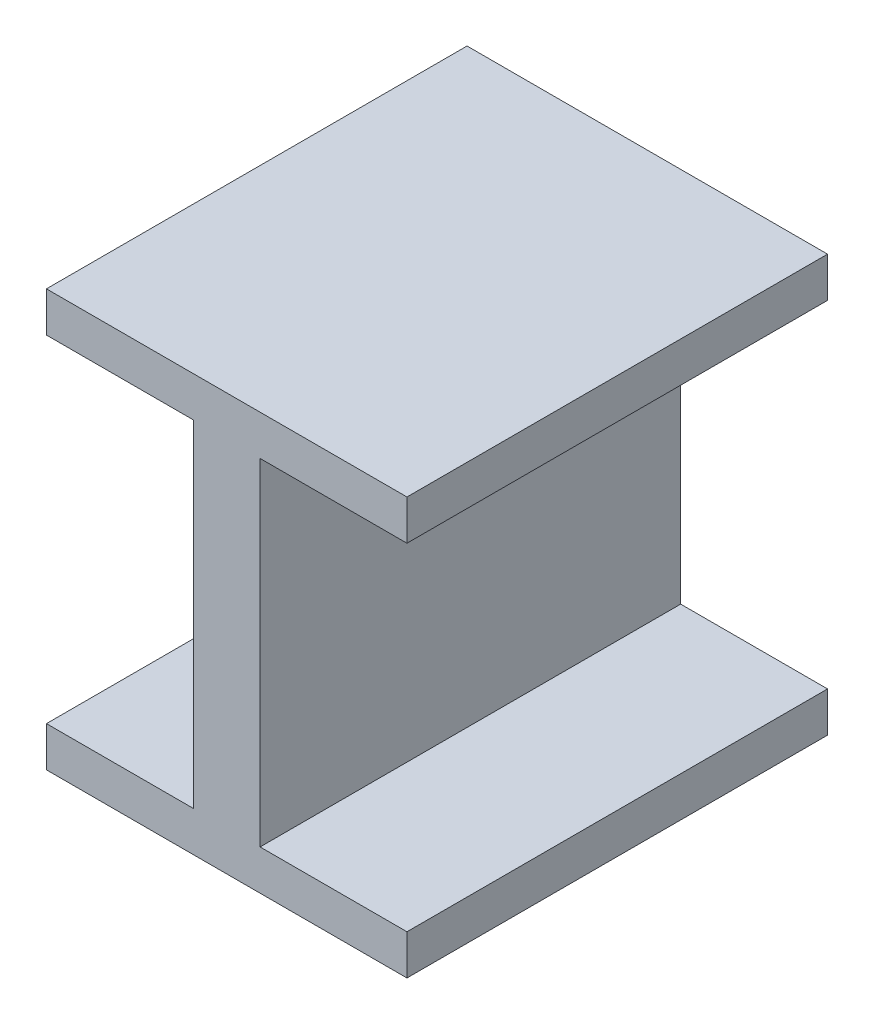
ISO-10303-21;
HEADER;
FILE_DESCRIPTION(('STEP AP214'),'2;1');
FILE_NAME('part.step','',(''),(''),'','','');
FILE_SCHEMA(('AUTOMOTIVE_DESIGN { 1 0 10303 214 1 1 1 1 }'));
ENDSEC;
DATA;
#1=APPLICATION_CONTEXT('core data for automotive mechanical design processes');
#2=APPLICATION_PROTOCOL_DEFINITION('international standard','automotive_design',2000,#1);
#3=PRODUCT_CONTEXT('',#1,'mechanical');
#4=PRODUCT('Part','Part','',(#3));
#5=PRODUCT_RELATED_PRODUCT_CATEGORY('part','',(#4));
#6=PRODUCT_DEFINITION_FORMATION('','',#4);
#7=PRODUCT_DEFINITION_CONTEXT('part definition',#1,'design');
#8=PRODUCT_DEFINITION('design','',#6,#7);
#9=PRODUCT_DEFINITION_SHAPE('','',#8);
#10=(LENGTH_UNIT() NAMED_UNIT(*) SI_UNIT(.MILLI.,.METRE.));
#11=(NAMED_UNIT(*) PLANE_ANGLE_UNIT() SI_UNIT($,.RADIAN.));
#12=(NAMED_UNIT(*) SI_UNIT($,.STERADIAN.) SOLID_ANGLE_UNIT());
#13=UNCERTAINTY_MEASURE_WITH_UNIT(LENGTH_MEASURE(1.E-05),#10,'distance_accuracy_value','');
#14=(GEOMETRIC_REPRESENTATION_CONTEXT(3) GLOBAL_UNCERTAINTY_ASSIGNED_CONTEXT((#13)) GLOBAL_UNIT_ASSIGNED_CONTEXT((#10,
#11,#12)) REPRESENTATION_CONTEXT('',''));
#15=CARTESIAN_POINT('',(0.,0.,0.));
#16=DIRECTION('',(0.,0.,1.));
#17=DIRECTION('',(1.,0.,0.));
#18=AXIS2_PLACEMENT_3D('',#15,#16,#17);
#19=CARTESIAN_POINT('',(0.,6.,0.));
#20=DIRECTION('',(0.,-1.,0.));
#21=DIRECTION('',(0.,0.,-1.));
#22=AXIS2_PLACEMENT_3D('',#19,#20,#21);
#23=PLANE('',#22);
#24=DIRECTION('',(0.,0.,1.));
#25=VECTOR('',#24,1.);
#26=CARTESIAN_POINT('',(-5.,6.,-31.5));
#27=LINE('',#26,#25);
#28=CARTESIAN_POINT('',(-5.,6.,-31.5));
#29=VERTEX_POINT('',#28);
#30=CARTESIAN_POINT('',(-5.,6.,31.5));
#31=VERTEX_POINT('',#30);
#32=EDGE_CURVE('E152',#29,#31,#27,.T.);
#33=ORIENTED_EDGE('',*,*,#32,.F.);
#34=DIRECTION('',(-1.,0.,0.));
#35=VECTOR('',#34,1.);
#36=CARTESIAN_POINT('',(-27.,6.,-31.5));
#37=LINE('',#36,#35);
#38=CARTESIAN_POINT('',(-27.,6.,-31.5));
#39=VERTEX_POINT('',#38);
#40=EDGE_CURVE('E247',#29,#39,#37,.T.);
#41=ORIENTED_EDGE('',*,*,#40,.T.);
#42=DIRECTION('',(0.,0.,1.));
#43=VECTOR('',#42,1.);
#44=CARTESIAN_POINT('',(-27.,6.,31.5));
#45=LINE('',#44,#43);
#46=CARTESIAN_POINT('',(-27.,6.,31.5));
#47=VERTEX_POINT('',#46);
#48=EDGE_CURVE('E222',#39,#47,#45,.T.);
#49=ORIENTED_EDGE('',*,*,#48,.T.);
#50=DIRECTION('',(1.,0.,0.));
#51=VECTOR('',#50,1.);
#52=CARTESIAN_POINT('',(-27.,6.,31.5));
#53=LINE('',#52,#51);
#54=EDGE_CURVE('E60',#47,#31,#53,.T.);
#55=ORIENTED_EDGE('',*,*,#54,.T.);
#56=EDGE_LOOP('',(#33,#41,#49,#55));
#57=FACE_BOUND('',#56,.T.);
#58=ADVANCED_FACE('F34',(#57),#23,.F.);
#59=DIRECTION('',(0.,0.,-1.));
#60=VECTOR('',#59,1.);
#61=CARTESIAN_POINT('',(5.,6.,-31.5));
#62=LINE('',#61,#60);
#63=CARTESIAN_POINT('',(5.,6.,31.5));
#64=VERTEX_POINT('',#63);
#65=CARTESIAN_POINT('',(5.,6.,-31.5));
#66=VERTEX_POINT('',#65);
#67=EDGE_CURVE('E52',#64,#66,#62,.T.);
#68=ORIENTED_EDGE('',*,*,#67,.F.);
#69=CARTESIAN_POINT('',(27.,6.,31.5));
#70=VERTEX_POINT('',#69);
#71=EDGE_CURVE('E219',#64,#70,#53,.T.);
#72=ORIENTED_EDGE('',*,*,#71,.T.);
#73=DIRECTION('',(0.,0.,-1.));
#74=VECTOR('',#73,1.);
#75=CARTESIAN_POINT('',(27.,6.,31.5));
#76=LINE('',#75,#74);
#77=CARTESIAN_POINT('',(27.,6.,-31.5));
#78=VERTEX_POINT('',#77);
#79=EDGE_CURVE('E237',#70,#78,#76,.T.);
#80=ORIENTED_EDGE('',*,*,#79,.T.);
#81=EDGE_CURVE('E246',#78,#66,#37,.T.);
#82=ORIENTED_EDGE('',*,*,#81,.T.);
#83=EDGE_LOOP('',(#68,#72,#80,#82));
#84=FACE_BOUND('',#83,.T.);
#85=ADVANCED_FACE('F284',(#84),#23,.F.);
#86=CARTESIAN_POINT('',(27.,6.,31.5));
#87=DIRECTION('',(-1.,0.,0.));
#88=DIRECTION('',(0.,0.,1.));
#89=AXIS2_PLACEMENT_3D('',#86,#87,#88);
#90=PLANE('',#89);
#91=DIRECTION('',(0.,0.,-1.));
#92=VECTOR('',#91,1.);
#93=CARTESIAN_POINT('',(27.,0.,31.5));
#94=LINE('',#93,#92);
#95=CARTESIAN_POINT('',(27.,0.,31.5));
#96=VERTEX_POINT('',#95);
#97=CARTESIAN_POINT('',(27.,0.,-31.5));
#98=VERTEX_POINT('',#97);
#99=EDGE_CURVE('E210',#96,#98,#94,.T.);
#100=ORIENTED_EDGE('',*,*,#99,.T.);
#101=DIRECTION('',(0.,-1.,0.));
#102=VECTOR('',#101,1.);
#103=CARTESIAN_POINT('',(27.,6.,-31.5));
#104=LINE('',#103,#102);
#105=EDGE_CURVE('E11',#78,#98,#104,.T.);
#106=ORIENTED_EDGE('',*,*,#105,.F.);
#107=ORIENTED_EDGE('',*,*,#79,.F.);
#108=DIRECTION('',(0.,-1.,0.));
#109=VECTOR('',#108,1.);
#110=CARTESIAN_POINT('',(27.,6.,31.5));
#111=LINE('',#110,#109);
#112=EDGE_CURVE('E238',#70,#96,#111,.T.);
#113=ORIENTED_EDGE('',*,*,#112,.T.);
#114=EDGE_LOOP('',(#100,#106,#107,#113));
#115=FACE_BOUND('',#114,.T.);
#116=ADVANCED_FACE('F36',(#115),#90,.F.);
#117=CARTESIAN_POINT('',(-27.,6.,-31.5));
#118=DIRECTION('',(0.,0.,1.));
#119=DIRECTION('',(1.,0.,0.));
#120=AXIS2_PLACEMENT_3D('',#117,#118,#119);
#121=PLANE('',#120);
#122=DIRECTION('',(-1.,0.,0.));
#123=VECTOR('',#122,1.);
#124=CARTESIAN_POINT('',(-27.,0.,-31.5));
#125=LINE('',#124,#123);
#126=CARTESIAN_POINT('',(-27.,0.,-31.5));
#127=VERTEX_POINT('',#126);
#128=EDGE_CURVE('E231',#98,#127,#125,.T.);
#129=ORIENTED_EDGE('',*,*,#128,.T.);
#130=DIRECTION('',(0.,-1.,0.));
#131=VECTOR('',#130,1.);
#132=CARTESIAN_POINT('',(-27.,6.,-31.5));
#133=LINE('',#132,#131);
#134=EDGE_CURVE('E44',#39,#127,#133,.T.);
#135=ORIENTED_EDGE('',*,*,#134,.F.);
#136=ORIENTED_EDGE('',*,*,#40,.F.);
#137=DIRECTION('',(0.,-1.,0.));
#138=VECTOR('',#137,1.);
#139=CARTESIAN_POINT('',(-5.,56.4,-31.5));
#140=LINE('',#139,#138);
#141=CARTESIAN_POINT('',(-5.,56.4,-31.5));
#142=VERTEX_POINT('',#141);
#143=EDGE_CURVE('E189',#142,#29,#140,.T.);
#144=ORIENTED_EDGE('',*,*,#143,.F.);
#145=DIRECTION('',(-1.,0.,0.));
#146=VECTOR('',#145,1.);
#147=CARTESIAN_POINT('',(-27.,56.4,-31.5));
#148=LINE('',#147,#146);
#149=CARTESIAN_POINT('',(-27.,56.4,-31.5));
#150=VERTEX_POINT('',#149);
#151=EDGE_CURVE('E163',#142,#150,#148,.T.);
#152=ORIENTED_EDGE('',*,*,#151,.T.);
#153=DIRECTION('',(0.,-1.,0.));
#154=VECTOR('',#153,1.);
#155=CARTESIAN_POINT('',(-27.,62.4,-31.5));
#156=LINE('',#155,#154);
#157=CARTESIAN_POINT('',(-27.,62.4,-31.5));
#158=VERTEX_POINT('',#157);
#159=EDGE_CURVE('E170',#158,#150,#156,.T.);
#160=ORIENTED_EDGE('',*,*,#159,.F.);
#161=DIRECTION('',(-1.,0.,0.));
#162=VECTOR('',#161,1.);
#163=CARTESIAN_POINT('',(-27.,62.4,-31.5));
#164=LINE('',#163,#162);
#165=CARTESIAN_POINT('',(27.,62.4,-31.5));
#166=VERTEX_POINT('',#165);
#167=EDGE_CURVE('E143',#166,#158,#164,.T.);
#168=ORIENTED_EDGE('',*,*,#167,.F.);
#169=DIRECTION('',(0.,-1.,0.));
#170=VECTOR('',#169,1.);
#171=CARTESIAN_POINT('',(27.,62.4,-31.5));
#172=LINE('',#171,#170);
#173=CARTESIAN_POINT('',(27.,56.4,-31.5));
#174=VERTEX_POINT('',#173);
#175=EDGE_CURVE('E156',#166,#174,#172,.T.);
#176=ORIENTED_EDGE('',*,*,#175,.T.);
#177=CARTESIAN_POINT('',(5.,56.4,-31.5));
#178=VERTEX_POINT('',#177);
#179=EDGE_CURVE('E147',#174,#178,#148,.T.);
#180=ORIENTED_EDGE('',*,*,#179,.T.);
#181=DIRECTION('',(0.,-1.,0.));
#182=VECTOR('',#181,1.);
#183=CARTESIAN_POINT('',(5.,56.4,-31.5));
#184=LINE('',#183,#182);
#185=EDGE_CURVE('E191',#178,#66,#184,.T.);
#186=ORIENTED_EDGE('',*,*,#185,.T.);
#187=ORIENTED_EDGE('',*,*,#81,.F.);
#188=ORIENTED_EDGE('',*,*,#105,.T.);
#189=EDGE_LOOP('',(#129,#135,#136,#144,#152,#160,#168,#176,#180,#186,#187,#188));
#190=FACE_BOUND('',#189,.T.);
#191=ADVANCED_FACE('F176',(#190),#121,.F.);
#192=CARTESIAN_POINT('',(-27.,6.,31.5));
#193=DIRECTION('',(1.,0.,0.));
#194=DIRECTION('',(0.,0.,-1.));
#195=AXIS2_PLACEMENT_3D('',#192,#193,#194);
#196=PLANE('',#195);
#197=DIRECTION('',(0.,0.,1.));
#198=VECTOR('',#197,1.);
#199=CARTESIAN_POINT('',(-27.,0.,31.5));
#200=LINE('',#199,#198);
#201=CARTESIAN_POINT('',(-27.,0.,31.5));
#202=VERTEX_POINT('',#201);
#203=EDGE_CURVE('E233',#127,#202,#200,.T.);
#204=ORIENTED_EDGE('',*,*,#203,.T.);
#205=DIRECTION('',(0.,-1.,0.));
#206=VECTOR('',#205,1.);
#207=CARTESIAN_POINT('',(-27.,6.,31.5));
#208=LINE('',#207,#206);
#209=EDGE_CURVE('E241',#47,#202,#208,.T.);
#210=ORIENTED_EDGE('',*,*,#209,.F.);
#211=ORIENTED_EDGE('',*,*,#48,.F.);
#212=ORIENTED_EDGE('',*,*,#134,.T.);
#213=EDGE_LOOP('',(#204,#210,#211,#212));
#214=FACE_BOUND('',#213,.T.);
#215=ADVANCED_FACE('F259',(#214),#196,.F.);
#216=CARTESIAN_POINT('',(-27.,6.,31.5));
#217=DIRECTION('',(0.,0.,-1.));
#218=DIRECTION('',(-1.,0.,0.));
#219=AXIS2_PLACEMENT_3D('',#216,#217,#218);
#220=PLANE('',#219);
#221=DIRECTION('',(1.,0.,0.));
#222=VECTOR('',#221,1.);
#223=CARTESIAN_POINT('',(-27.,0.,31.5));
#224=LINE('',#223,#222);
#225=EDGE_CURVE('E235',#202,#96,#224,.T.);
#226=ORIENTED_EDGE('',*,*,#225,.T.);
#227=ORIENTED_EDGE('',*,*,#112,.F.);
#228=ORIENTED_EDGE('',*,*,#71,.F.);
#229=DIRECTION('',(0.,-1.,0.));
#230=VECTOR('',#229,1.);
#231=CARTESIAN_POINT('',(5.,56.4,31.5));
#232=LINE('',#231,#230);
#233=CARTESIAN_POINT('',(5.,56.4,31.5));
#234=VERTEX_POINT('',#233);
#235=EDGE_CURVE('E211',#234,#64,#232,.T.);
#236=ORIENTED_EDGE('',*,*,#235,.F.);
#237=DIRECTION('',(1.,0.,0.));
#238=VECTOR('',#237,1.);
#239=CARTESIAN_POINT('',(-27.,56.4,31.5));
#240=LINE('',#239,#238);
#241=CARTESIAN_POINT('',(27.,56.4,31.5));
#242=VERTEX_POINT('',#241);
#243=EDGE_CURVE('E186',#234,#242,#240,.T.);
#244=ORIENTED_EDGE('',*,*,#243,.T.);
#245=DIRECTION('',(0.,-1.,0.));
#246=VECTOR('',#245,1.);
#247=CARTESIAN_POINT('',(27.,62.4,31.5));
#248=LINE('',#247,#246);
#249=CARTESIAN_POINT('',(27.,62.4,31.5));
#250=VERTEX_POINT('',#249);
#251=EDGE_CURVE('E134',#250,#242,#248,.T.);
#252=ORIENTED_EDGE('',*,*,#251,.F.);
#253=DIRECTION('',(1.,0.,0.));
#254=VECTOR('',#253,1.);
#255=CARTESIAN_POINT('',(-27.,62.4,31.5));
#256=LINE('',#255,#254);
#257=CARTESIAN_POINT('',(-27.,62.4,31.5));
#258=VERTEX_POINT('',#257);
#259=EDGE_CURVE('E126',#258,#250,#256,.T.);
#260=ORIENTED_EDGE('',*,*,#259,.F.);
#261=DIRECTION('',(0.,-1.,0.));
#262=VECTOR('',#261,1.);
#263=CARTESIAN_POINT('',(-27.,62.4,31.5));
#264=LINE('',#263,#262);
#265=CARTESIAN_POINT('',(-27.,56.4,31.5));
#266=VERTEX_POINT('',#265);
#267=EDGE_CURVE('E131',#258,#266,#264,.T.);
#268=ORIENTED_EDGE('',*,*,#267,.T.);
#269=CARTESIAN_POINT('',(-5.,56.4,31.5));
#270=VERTEX_POINT('',#269);
#271=EDGE_CURVE('E261',#266,#270,#240,.T.);
#272=ORIENTED_EDGE('',*,*,#271,.T.);
#273=DIRECTION('',(0.,-1.,0.));
#274=VECTOR('',#273,1.);
#275=CARTESIAN_POINT('',(-5.,56.4,31.5));
#276=LINE('',#275,#274);
#277=EDGE_CURVE('E208',#270,#31,#276,.T.);
#278=ORIENTED_EDGE('',*,*,#277,.T.);
#279=ORIENTED_EDGE('',*,*,#54,.F.);
#280=ORIENTED_EDGE('',*,*,#209,.T.);
#281=EDGE_LOOP('',(#226,#227,#228,#236,#244,#252,#260,#268,#272,#278,#279,#280));
#282=FACE_BOUND('',#281,.T.);
#283=ADVANCED_FACE('F128',(#282),#220,.F.);
#284=CARTESIAN_POINT('',(0.,0.,0.));
#285=DIRECTION('',(0.,-1.,0.));
#286=DIRECTION('',(0.,0.,-1.));
#287=AXIS2_PLACEMENT_3D('',#284,#285,#286);
#288=PLANE('',#287);
#289=ORIENTED_EDGE('',*,*,#99,.F.);
#290=ORIENTED_EDGE('',*,*,#225,.F.);
#291=ORIENTED_EDGE('',*,*,#203,.F.);
#292=ORIENTED_EDGE('',*,*,#128,.F.);
#293=EDGE_LOOP('',(#289,#290,#291,#292));
#294=FACE_BOUND('',#293,.T.);
#295=ADVANCED_FACE('F292',(#294),#288,.T.);
#296=CARTESIAN_POINT('',(-5.,56.4,-31.5));
#297=DIRECTION('',(1.,0.,0.));
#298=DIRECTION('',(0.,0.,-1.));
#299=AXIS2_PLACEMENT_3D('',#296,#297,#298);
#300=PLANE('',#299);
#301=ORIENTED_EDGE('',*,*,#32,.T.);
#302=ORIENTED_EDGE('',*,*,#277,.F.);
#303=DIRECTION('',(0.,0.,1.));
#304=VECTOR('',#303,1.);
#305=CARTESIAN_POINT('',(-5.,56.4,-31.5));
#306=LINE('',#305,#304);
#307=EDGE_CURVE('E38',#142,#270,#306,.T.);
#308=ORIENTED_EDGE('',*,*,#307,.F.);
#309=ORIENTED_EDGE('',*,*,#143,.T.);
#310=EDGE_LOOP('',(#301,#302,#308,#309));
#311=FACE_BOUND('',#310,.T.);
#312=ADVANCED_FACE('F264',(#311),#300,.F.);
#313=CARTESIAN_POINT('',(5.,56.4,-31.5));
#314=DIRECTION('',(-1.,0.,0.));
#315=DIRECTION('',(0.,0.,1.));
#316=AXIS2_PLACEMENT_3D('',#313,#314,#315);
#317=PLANE('',#316);
#318=ORIENTED_EDGE('',*,*,#67,.T.);
#319=ORIENTED_EDGE('',*,*,#185,.F.);
#320=DIRECTION('',(0.,0.,-1.));
#321=VECTOR('',#320,1.);
#322=CARTESIAN_POINT('',(5.,56.4,-31.5));
#323=LINE('',#322,#321);
#324=EDGE_CURVE('E185',#234,#178,#323,.T.);
#325=ORIENTED_EDGE('',*,*,#324,.F.);
#326=ORIENTED_EDGE('',*,*,#235,.T.);
#327=EDGE_LOOP('',(#318,#319,#325,#326));
#328=FACE_BOUND('',#327,.T.);
#329=ADVANCED_FACE('F308',(#328),#317,.F.);
#330=CARTESIAN_POINT('',(0.,56.4,0.));
#331=DIRECTION('',(0.,1.,0.));
#332=DIRECTION('',(0.,0.,1.));
#333=AXIS2_PLACEMENT_3D('',#330,#331,#332);
#334=PLANE('',#333);
#335=ORIENTED_EDGE('',*,*,#151,.F.);
#336=ORIENTED_EDGE('',*,*,#307,.T.);
#337=ORIENTED_EDGE('',*,*,#271,.F.);
#338=DIRECTION('',(0.,0.,1.));
#339=VECTOR('',#338,1.);
#340=CARTESIAN_POINT('',(-27.,56.4,-31.5));
#341=LINE('',#340,#339);
#342=EDGE_CURVE('E151',#150,#266,#341,.T.);
#343=ORIENTED_EDGE('',*,*,#342,.F.);
#344=EDGE_LOOP('',(#335,#336,#337,#343));
#345=FACE_BOUND('',#344,.T.);
#346=ADVANCED_FACE('F267',(#345),#334,.F.);
#347=ORIENTED_EDGE('',*,*,#243,.F.);
#348=ORIENTED_EDGE('',*,*,#324,.T.);
#349=ORIENTED_EDGE('',*,*,#179,.F.);
#350=DIRECTION('',(0.,0.,-1.));
#351=VECTOR('',#350,1.);
#352=CARTESIAN_POINT('',(27.,56.4,-31.5));
#353=LINE('',#352,#351);
#354=EDGE_CURVE('E168',#242,#174,#353,.T.);
#355=ORIENTED_EDGE('',*,*,#354,.F.);
#356=EDGE_LOOP('',(#347,#348,#349,#355));
#357=FACE_BOUND('',#356,.T.);
#358=ADVANCED_FACE('F183',(#357),#334,.F.);
#359=CARTESIAN_POINT('',(-27.,62.4,-31.5));
#360=DIRECTION('',(1.,0.,0.));
#361=DIRECTION('',(0.,0.,-1.));
#362=AXIS2_PLACEMENT_3D('',#359,#360,#361);
#363=PLANE('',#362);
#364=ORIENTED_EDGE('',*,*,#342,.T.);
#365=ORIENTED_EDGE('',*,*,#267,.F.);
#366=DIRECTION('',(0.,0.,1.));
#367=VECTOR('',#366,1.);
#368=CARTESIAN_POINT('',(-27.,62.4,-31.5));
#369=LINE('',#368,#367);
#370=EDGE_CURVE('E138',#158,#258,#369,.T.);
#371=ORIENTED_EDGE('',*,*,#370,.F.);
#372=ORIENTED_EDGE('',*,*,#159,.T.);
#373=EDGE_LOOP('',(#364,#365,#371,#372));
#374=FACE_BOUND('',#373,.T.);
#375=ADVANCED_FACE('F149',(#374),#363,.F.);
#376=CARTESIAN_POINT('',(27.,62.4,-31.5));
#377=DIRECTION('',(-1.,0.,0.));
#378=DIRECTION('',(0.,0.,1.));
#379=AXIS2_PLACEMENT_3D('',#376,#377,#378);
#380=PLANE('',#379);
#381=ORIENTED_EDGE('',*,*,#354,.T.);
#382=ORIENTED_EDGE('',*,*,#175,.F.);
#383=DIRECTION('',(0.,0.,-1.));
#384=VECTOR('',#383,1.);
#385=CARTESIAN_POINT('',(27.,62.4,-31.5));
#386=LINE('',#385,#384);
#387=EDGE_CURVE('E137',#250,#166,#386,.T.);
#388=ORIENTED_EDGE('',*,*,#387,.F.);
#389=ORIENTED_EDGE('',*,*,#251,.T.);
#390=EDGE_LOOP('',(#381,#382,#388,#389));
#391=FACE_BOUND('',#390,.T.);
#392=ADVANCED_FACE('F273',(#391),#380,.F.);
#393=CARTESIAN_POINT('',(0.,62.4,0.));
#394=DIRECTION('',(0.,1.,0.));
#395=DIRECTION('',(0.,0.,1.));
#396=AXIS2_PLACEMENT_3D('',#393,#394,#395);
#397=PLANE('',#396);
#398=ORIENTED_EDGE('',*,*,#370,.T.);
#399=ORIENTED_EDGE('',*,*,#259,.T.);
#400=ORIENTED_EDGE('',*,*,#387,.T.);
#401=ORIENTED_EDGE('',*,*,#167,.T.);
#402=EDGE_LOOP('',(#398,#399,#400,#401));
#403=FACE_BOUND('',#402,.T.);
#404=ADVANCED_FACE('F141',(#403),#397,.T.);
#405=CLOSED_SHELL('',(#58,#85,#116,#191,#215,#283,#295,#312,#329,#346,#358,#375,#392,#404));
#406=MANIFOLD_SOLID_BREP('B2',#405);
#407=ADVANCED_BREP_SHAPE_REPRESENTATION('',(#18,#406),#14);
#408=SHAPE_DEFINITION_REPRESENTATION(#9,#407);
ENDSEC;
END-ISO-10303-21;
